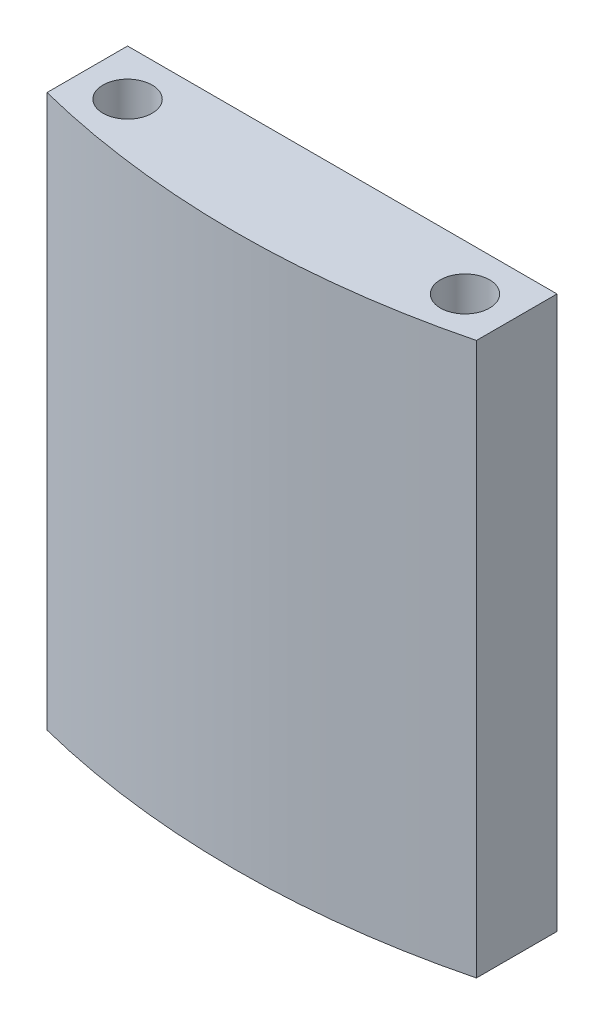
ISO-10303-21;
HEADER;
FILE_DESCRIPTION(('STEP AP214'),'2;1');
FILE_NAME('part.step','',(''),(''),'','','');
FILE_SCHEMA(('AUTOMOTIVE_DESIGN { 1 0 10303 214 1 1 1 1 }'));
ENDSEC;
DATA;
#1=APPLICATION_CONTEXT('core data for automotive mechanical design processes');
#2=APPLICATION_PROTOCOL_DEFINITION('international standard','automotive_design',2000,#1);
#3=PRODUCT_CONTEXT('',#1,'mechanical');
#4=PRODUCT('Part','Part','',(#3));
#5=PRODUCT_RELATED_PRODUCT_CATEGORY('part','',(#4));
#6=PRODUCT_DEFINITION_FORMATION('','',#4);
#7=PRODUCT_DEFINITION_CONTEXT('part definition',#1,'design');
#8=PRODUCT_DEFINITION('design','',#6,#7);
#9=PRODUCT_DEFINITION_SHAPE('','',#8);
#10=(LENGTH_UNIT() NAMED_UNIT(*) SI_UNIT(.MILLI.,.METRE.));
#11=(NAMED_UNIT(*) PLANE_ANGLE_UNIT() SI_UNIT($,.RADIAN.));
#12=(NAMED_UNIT(*) SI_UNIT($,.STERADIAN.) SOLID_ANGLE_UNIT());
#13=UNCERTAINTY_MEASURE_WITH_UNIT(LENGTH_MEASURE(1.E-05),#10,'distance_accuracy_value','');
#14=(GEOMETRIC_REPRESENTATION_CONTEXT(3) GLOBAL_UNCERTAINTY_ASSIGNED_CONTEXT((#13)) GLOBAL_UNIT_ASSIGNED_CONTEXT((#10,
#11,#12)) REPRESENTATION_CONTEXT('',''));
#15=CARTESIAN_POINT('',(0.,0.,0.));
#16=DIRECTION('',(0.,0.,1.));
#17=DIRECTION('',(1.,0.,0.));
#18=AXIS2_PLACEMENT_3D('',#15,#16,#17);
#19=CARTESIAN_POINT('',(0.,0.,-2.));
#20=DIRECTION('',(0.,0.,1.));
#21=DIRECTION('',(1.,0.,0.));
#22=AXIS2_PLACEMENT_3D('',#19,#20,#21);
#23=PLANE('',#22);
#24=CARTESIAN_POINT('',(0.,0.,-2.));
#25=DIRECTION('',(0.,0.,-1.));
#26=DIRECTION('',(-1.,0.,0.));
#27=AXIS2_PLACEMENT_3D('',#24,#25,#26);
#28=CIRCLE('',#27,1.75);
#29=CARTESIAN_POINT('',(-1.75,0.,-2.));
#30=VERTEX_POINT('',#29);
#31=EDGE_CURVE('E123',#30,#30,#28,.T.);
#32=ORIENTED_EDGE('',*,*,#31,.F.);
#33=EDGE_LOOP('',(#32));
#34=FACE_BOUND('',#33,.T.);
#35=CARTESIAN_POINT('',(0.,-13.25,-2.));
#36=DIRECTION('',(0.,0.,1.));
#37=DIRECTION('',(1.,0.,0.));
#38=AXIS2_PLACEMENT_3D('',#35,#36,#37);
#39=CIRCLE('',#38,1.45);
#40=CARTESIAN_POINT('',(1.45000000000001,-13.25,-2.));
#41=VERTEX_POINT('',#40);
#42=EDGE_CURVE('E128',#41,#41,#39,.F.);
#43=ORIENTED_EDGE('',*,*,#42,.F.);
#44=EDGE_LOOP('',(#43));
#45=FACE_BOUND('',#44,.T.);
#46=DIRECTION('',(1.,0.,0.));
#47=VECTOR('',#46,1.);
#48=CARTESIAN_POINT('',(0.,-18.,-2.));
#49=LINE('',#48,#47);
#50=CARTESIAN_POINT('',(-14.,-18.,-2.));
#51=VERTEX_POINT('',#50);
#52=CARTESIAN_POINT('',(14.,-18.,-2.));
#53=VERTEX_POINT('',#52);
#54=EDGE_CURVE('E141',#51,#53,#49,.T.);
#55=ORIENTED_EDGE('',*,*,#54,.F.);
#56=DIRECTION('',(0.,1.,0.));
#57=VECTOR('',#56,1.);
#58=CARTESIAN_POINT('',(-14.,0.,-2.));
#59=LINE('',#58,#57);
#60=CARTESIAN_POINT('',(-14.,18.,-2.));
#61=VERTEX_POINT('',#60);
#62=EDGE_CURVE('E97',#51,#61,#59,.T.);
#63=ORIENTED_EDGE('',*,*,#62,.T.);
#64=DIRECTION('',(1.,0.,0.));
#65=VECTOR('',#64,1.);
#66=CARTESIAN_POINT('',(0.,18.,-2.));
#67=LINE('',#66,#65);
#68=CARTESIAN_POINT('',(14.,18.,-2.));
#69=VERTEX_POINT('',#68);
#70=EDGE_CURVE('E154',#61,#69,#67,.T.);
#71=ORIENTED_EDGE('',*,*,#70,.T.);
#72=DIRECTION('',(0.,1.,0.));
#73=VECTOR('',#72,1.);
#74=CARTESIAN_POINT('',(14.,0.,-2.));
#75=LINE('',#74,#73);
#76=EDGE_CURVE('E150',#53,#69,#75,.T.);
#77=ORIENTED_EDGE('',*,*,#76,.F.);
#78=EDGE_LOOP('',(#55,#63,#71,#77));
#79=FACE_BOUND('',#78,.T.);
#80=CARTESIAN_POINT('',(0.,13.25,-2.));
#81=DIRECTION('',(0.,0.,1.));
#82=DIRECTION('',(1.,0.,0.));
#83=AXIS2_PLACEMENT_3D('',#80,#81,#82);
#84=CIRCLE('',#83,1.45);
#85=CARTESIAN_POINT('',(1.45,13.25,-2.));
#86=VERTEX_POINT('',#85);
#87=EDGE_CURVE('E132',#86,#86,#84,.T.);
#88=ORIENTED_EDGE('',*,*,#87,.T.);
#89=EDGE_LOOP('',(#88));
#90=FACE_BOUND('',#89,.T.);
#91=ADVANCED_FACE('F51',(#34,#45,#79,#90),#23,.F.);
#92=CARTESIAN_POINT('',(0.,-18.,2.));
#93=DIRECTION('',(0.,1.,0.));
#94=DIRECTION('',(0.,0.,1.));
#95=AXIS2_PLACEMENT_3D('',#92,#93,#94);
#96=PLANE('',#95);
#97=CARTESIAN_POINT('',(-11.,-18.,1.));
#98=DIRECTION('',(0.,1.,0.));
#99=DIRECTION('',(0.,0.,1.));
#100=AXIS2_PLACEMENT_3D('',#97,#98,#99);
#101=CIRCLE('',#100,1.6);
#102=CARTESIAN_POINT('',(-11.,-18.,2.6));
#103=VERTEX_POINT('',#102);
#104=EDGE_CURVE('E209',#103,#103,#101,.T.);
#105=ORIENTED_EDGE('',*,*,#104,.T.);
#106=EDGE_LOOP('',(#105));
#107=FACE_BOUND('',#106,.T.);
#108=CARTESIAN_POINT('',(11.,-18.,1.));
#109=DIRECTION('',(0.,1.,0.));
#110=DIRECTION('',(0.,0.,1.));
#111=AXIS2_PLACEMENT_3D('',#108,#109,#110);
#112=CIRCLE('',#111,1.6);
#113=CARTESIAN_POINT('',(11.,-18.,2.6));
#114=VERTEX_POINT('',#113);
#115=EDGE_CURVE('E117',#114,#114,#112,.T.);
#116=ORIENTED_EDGE('',*,*,#115,.T.);
#117=EDGE_LOOP('',(#116));
#118=FACE_BOUND('',#117,.T.);
#119=ORIENTED_EDGE('',*,*,#54,.T.);
#120=DIRECTION('',(0.,0.,-1.));
#121=VECTOR('',#120,1.);
#122=CARTESIAN_POINT('',(14.,-18.,2.));
#123=LINE('',#122,#121);
#124=CARTESIAN_POINT('',(14.,-18.,3.25395913416522));
#125=VERTEX_POINT('',#124);
#126=EDGE_CURVE('E11',#125,#53,#123,.T.);
#127=ORIENTED_EDGE('',*,*,#126,.F.);
#128=CARTESIAN_POINT('',(0.,-18.,-52.));
#129=DIRECTION('',(0.,1.,0.));
#130=DIRECTION('',(0.,0.,1.));
#131=AXIS2_PLACEMENT_3D('',#128,#129,#130);
#132=CIRCLE('',#131,57.);
#133=CARTESIAN_POINT('',(-14.,-18.,3.25395913416521));
#134=VERTEX_POINT('',#133);
#135=EDGE_CURVE('E104',#134,#125,#132,.T.);
#136=ORIENTED_EDGE('',*,*,#135,.F.);
#137=DIRECTION('',(0.,0.,-1.));
#138=VECTOR('',#137,1.);
#139=CARTESIAN_POINT('',(-14.,-18.,2.));
#140=LINE('',#139,#138);
#141=EDGE_CURVE('E67',#134,#51,#140,.T.);
#142=ORIENTED_EDGE('',*,*,#141,.T.);
#143=EDGE_LOOP('',(#119,#127,#136,#142));
#144=FACE_BOUND('',#143,.T.);
#145=ADVANCED_FACE('F53',(#107,#118,#144),#96,.F.);
#146=CARTESIAN_POINT('',(14.,0.,2.));
#147=DIRECTION('',(-1.,0.,0.));
#148=DIRECTION('',(0.,0.,1.));
#149=AXIS2_PLACEMENT_3D('',#146,#147,#148);
#150=PLANE('',#149);
#151=ORIENTED_EDGE('',*,*,#76,.T.);
#152=DIRECTION('',(0.,0.,-1.));
#153=VECTOR('',#152,1.);
#154=CARTESIAN_POINT('',(14.,18.,2.));
#155=LINE('',#154,#153);
#156=CARTESIAN_POINT('',(14.,18.,3.25395913416522));
#157=VERTEX_POINT('',#156);
#158=EDGE_CURVE('E60',#157,#69,#155,.T.);
#159=ORIENTED_EDGE('',*,*,#158,.F.);
#160=DIRECTION('',(0.,1.,0.));
#161=VECTOR('',#160,1.);
#162=CARTESIAN_POINT('',(14.,-18.,3.25395913416522));
#163=LINE('',#162,#161);
#164=EDGE_CURVE('E108',#125,#157,#163,.T.);
#165=ORIENTED_EDGE('',*,*,#164,.F.);
#166=ORIENTED_EDGE('',*,*,#126,.T.);
#167=EDGE_LOOP('',(#151,#159,#165,#166));
#168=FACE_BOUND('',#167,.T.);
#169=ADVANCED_FACE('F166',(#168),#150,.F.);
#170=CARTESIAN_POINT('',(0.,18.,2.));
#171=DIRECTION('',(0.,1.,0.));
#172=DIRECTION('',(0.,0.,1.));
#173=AXIS2_PLACEMENT_3D('',#170,#171,#172);
#174=PLANE('',#173);
#175=CARTESIAN_POINT('',(-11.,18.,1.));
#176=DIRECTION('',(0.,1.,0.));
#177=DIRECTION('',(0.,0.,1.));
#178=AXIS2_PLACEMENT_3D('',#175,#176,#177);
#179=CIRCLE('',#178,1.6);
#180=CARTESIAN_POINT('',(-11.,18.,2.6));
#181=VERTEX_POINT('',#180);
#182=EDGE_CURVE('E221',#181,#181,#179,.T.);
#183=ORIENTED_EDGE('',*,*,#182,.F.);
#184=EDGE_LOOP('',(#183));
#185=FACE_BOUND('',#184,.T.);
#186=CARTESIAN_POINT('',(11.,18.,1.));
#187=DIRECTION('',(0.,1.,0.));
#188=DIRECTION('',(0.,0.,1.));
#189=AXIS2_PLACEMENT_3D('',#186,#187,#188);
#190=CIRCLE('',#189,1.6);
#191=CARTESIAN_POINT('',(11.,18.,2.6));
#192=VERTEX_POINT('',#191);
#193=EDGE_CURVE('E214',#192,#192,#190,.T.);
#194=ORIENTED_EDGE('',*,*,#193,.F.);
#195=EDGE_LOOP('',(#194));
#196=FACE_BOUND('',#195,.T.);
#197=ORIENTED_EDGE('',*,*,#70,.F.);
#198=DIRECTION('',(0.,0.,-1.));
#199=VECTOR('',#198,1.);
#200=CARTESIAN_POINT('',(-14.,18.,2.));
#201=LINE('',#200,#199);
#202=CARTESIAN_POINT('',(-14.,18.,3.25395913416521));
#203=VERTEX_POINT('',#202);
#204=EDGE_CURVE('E75',#203,#61,#201,.T.);
#205=ORIENTED_EDGE('',*,*,#204,.F.);
#206=CARTESIAN_POINT('',(0.,18.,-52.));
#207=DIRECTION('',(0.,1.,0.));
#208=DIRECTION('',(0.,0.,1.));
#209=AXIS2_PLACEMENT_3D('',#206,#207,#208);
#210=CIRCLE('',#209,57.);
#211=EDGE_CURVE('E106',#203,#157,#210,.T.);
#212=ORIENTED_EDGE('',*,*,#211,.T.);
#213=ORIENTED_EDGE('',*,*,#158,.T.);
#214=EDGE_LOOP('',(#197,#205,#212,#213));
#215=FACE_BOUND('',#214,.T.);
#216=ADVANCED_FACE('F164',(#185,#196,#215),#174,.T.);
#217=CARTESIAN_POINT('',(-14.,0.,2.));
#218=DIRECTION('',(-1.,0.,0.));
#219=DIRECTION('',(0.,0.,1.));
#220=AXIS2_PLACEMENT_3D('',#217,#218,#219);
#221=PLANE('',#220);
#222=ORIENTED_EDGE('',*,*,#62,.F.);
#223=ORIENTED_EDGE('',*,*,#141,.F.);
#224=DIRECTION('',(0.,1.,0.));
#225=VECTOR('',#224,1.);
#226=CARTESIAN_POINT('',(-14.,-18.,3.25395913416521));
#227=LINE('',#226,#225);
#228=EDGE_CURVE('E94',#134,#203,#227,.T.);
#229=ORIENTED_EDGE('',*,*,#228,.T.);
#230=ORIENTED_EDGE('',*,*,#204,.T.);
#231=EDGE_LOOP('',(#222,#223,#229,#230));
#232=FACE_BOUND('',#231,.T.);
#233=ADVANCED_FACE('F93',(#232),#221,.T.);
#234=CARTESIAN_POINT('',(0.,-13.25,1.));
#235=DIRECTION('',(0.,0.,-1.));
#236=DIRECTION('',(-1.,0.,0.));
#237=AXIS2_PLACEMENT_3D('',#234,#235,#236);
#238=CYLINDRICAL_SURFACE('',#237,1.45);
#239=CARTESIAN_POINT('',(0.,-13.25,1.));
#240=DIRECTION('',(0.,0.,1.));
#241=DIRECTION('',(1.,0.,0.));
#242=AXIS2_PLACEMENT_3D('',#239,#240,#241);
#243=CIRCLE('',#242,1.45);
#244=CARTESIAN_POINT('',(1.45000000000001,-13.25,1.));
#245=VERTEX_POINT('',#244);
#246=EDGE_CURVE('E137',#245,#245,#243,.F.);
#247=ORIENTED_EDGE('',*,*,#246,.F.);
#248=EDGE_LOOP('',(#247));
#249=FACE_BOUND('',#248,.T.);
#250=ORIENTED_EDGE('',*,*,#42,.T.);
#251=EDGE_LOOP('',(#250));
#252=FACE_BOUND('',#251,.T.);
#253=ADVANCED_FACE('F187',(#249,#252),#238,.F.);
#254=CARTESIAN_POINT('',(0.,0.,1.));
#255=DIRECTION('',(0.,0.,1.));
#256=DIRECTION('',(1.,0.,0.));
#257=AXIS2_PLACEMENT_3D('',#254,#255,#256);
#258=PLANE('',#257);
#259=ORIENTED_EDGE('',*,*,#246,.T.);
#260=EDGE_LOOP('',(#259));
#261=FACE_BOUND('',#260,.T.);
#262=ADVANCED_FACE('F177',(#261),#258,.F.);
#263=CARTESIAN_POINT('',(0.,13.25,1.));
#264=DIRECTION('',(0.,0.,-1.));
#265=DIRECTION('',(-1.,0.,0.));
#266=AXIS2_PLACEMENT_3D('',#263,#264,#265);
#267=CYLINDRICAL_SURFACE('',#266,1.45);
#268=CARTESIAN_POINT('',(0.,13.25,1.));
#269=DIRECTION('',(0.,0.,1.));
#270=DIRECTION('',(1.,0.,0.));
#271=AXIS2_PLACEMENT_3D('',#268,#269,#270);
#272=CIRCLE('',#271,1.45);
#273=CARTESIAN_POINT('',(1.45,13.25,1.));
#274=VERTEX_POINT('',#273);
#275=EDGE_CURVE('E136',#274,#274,#272,.T.);
#276=ORIENTED_EDGE('',*,*,#275,.T.);
#277=EDGE_LOOP('',(#276));
#278=FACE_BOUND('',#277,.T.);
#279=ORIENTED_EDGE('',*,*,#87,.F.);
#280=EDGE_LOOP('',(#279));
#281=FACE_BOUND('',#280,.T.);
#282=ADVANCED_FACE('F174',(#278,#281),#267,.F.);
#283=CARTESIAN_POINT('',(0.,0.,1.));
#284=DIRECTION('',(0.,0.,1.));
#285=DIRECTION('',(1.,0.,0.));
#286=AXIS2_PLACEMENT_3D('',#283,#284,#285);
#287=PLANE('',#286);
#288=ORIENTED_EDGE('',*,*,#275,.F.);
#289=EDGE_LOOP('',(#288));
#290=FACE_BOUND('',#289,.T.);
#291=ADVANCED_FACE('F176',(#290),#287,.F.);
#292=CARTESIAN_POINT('',(0.,0.,2.));
#293=DIRECTION('',(0.,0.,-1.));
#294=DIRECTION('',(-1.,0.,0.));
#295=AXIS2_PLACEMENT_3D('',#292,#293,#294);
#296=CYLINDRICAL_SURFACE('',#295,1.75);
#297=CARTESIAN_POINT('',(0.,0.,2.));
#298=DIRECTION('',(0.,0.,-1.));
#299=DIRECTION('',(-1.,0.,0.));
#300=AXIS2_PLACEMENT_3D('',#297,#298,#299);
#301=CIRCLE('',#300,1.75);
#302=CARTESIAN_POINT('',(-1.75,0.,2.));
#303=VERTEX_POINT('',#302);
#304=EDGE_CURVE('E125',#303,#303,#301,.T.);
#305=ORIENTED_EDGE('',*,*,#304,.F.);
#306=EDGE_LOOP('',(#305));
#307=FACE_BOUND('',#306,.T.);
#308=ORIENTED_EDGE('',*,*,#31,.T.);
#309=EDGE_LOOP('',(#308));
#310=FACE_BOUND('',#309,.T.);
#311=ADVANCED_FACE('F184',(#307,#310),#296,.F.);
#312=CARTESIAN_POINT('',(-14.,-18.,2.));
#313=DIRECTION('',(0.,0.,-1.));
#314=DIRECTION('',(-1.,0.,0.));
#315=AXIS2_PLACEMENT_3D('',#312,#313,#314);
#316=PLANE('',#315);
#317=ORIENTED_EDGE('',*,*,#304,.T.);
#318=EDGE_LOOP('',(#317));
#319=FACE_BOUND('',#318,.T.);
#320=ADVANCED_FACE('F240',(#319),#316,.T.);
#321=CARTESIAN_POINT('',(0.,-18.,-52.));
#322=DIRECTION('',(0.,1.,0.));
#323=DIRECTION('',(0.,0.,1.));
#324=AXIS2_PLACEMENT_3D('',#321,#322,#323);
#325=CYLINDRICAL_SURFACE('',#324,57.);
#326=ORIENTED_EDGE('',*,*,#211,.F.);
#327=ORIENTED_EDGE('',*,*,#228,.F.);
#328=ORIENTED_EDGE('',*,*,#135,.T.);
#329=ORIENTED_EDGE('',*,*,#164,.T.);
#330=EDGE_LOOP('',(#326,#327,#328,#329));
#331=FACE_BOUND('',#330,.T.);
#332=ADVANCED_FACE('F102',(#331),#325,.T.);
#333=CARTESIAN_POINT('',(11.,18.,1.));
#334=DIRECTION('',(0.,1.,0.));
#335=DIRECTION('',(0.,0.,1.));
#336=AXIS2_PLACEMENT_3D('',#333,#334,#335);
#337=CYLINDRICAL_SURFACE('',#336,1.6);
#338=ORIENTED_EDGE('',*,*,#115,.F.);
#339=EDGE_LOOP('',(#338));
#340=FACE_BOUND('',#339,.T.);
#341=ORIENTED_EDGE('',*,*,#193,.T.);
#342=EDGE_LOOP('',(#341));
#343=FACE_BOUND('',#342,.T.);
#344=ADVANCED_FACE('F232',(#340,#343),#337,.F.);
#345=CARTESIAN_POINT('',(-11.,18.,1.));
#346=DIRECTION('',(0.,1.,0.));
#347=DIRECTION('',(0.,0.,1.));
#348=AXIS2_PLACEMENT_3D('',#345,#346,#347);
#349=CYLINDRICAL_SURFACE('',#348,1.6);
#350=ORIENTED_EDGE('',*,*,#104,.F.);
#351=EDGE_LOOP('',(#350));
#352=FACE_BOUND('',#351,.T.);
#353=ORIENTED_EDGE('',*,*,#182,.T.);
#354=EDGE_LOOP('',(#353));
#355=FACE_BOUND('',#354,.T.);
#356=ADVANCED_FACE('F229',(#352,#355),#349,.F.);
#357=CLOSED_SHELL('',(#91,#145,#169,#216,#233,#253,#262,#282,#291,#311,#320,#332,#344,#356));
#358=MANIFOLD_SOLID_BREP('B2',#357);
#359=ADVANCED_BREP_SHAPE_REPRESENTATION('',(#18,#358),#14);
#360=SHAPE_DEFINITION_REPRESENTATION(#9,#359);
ENDSEC;
END-ISO-10303-21;
